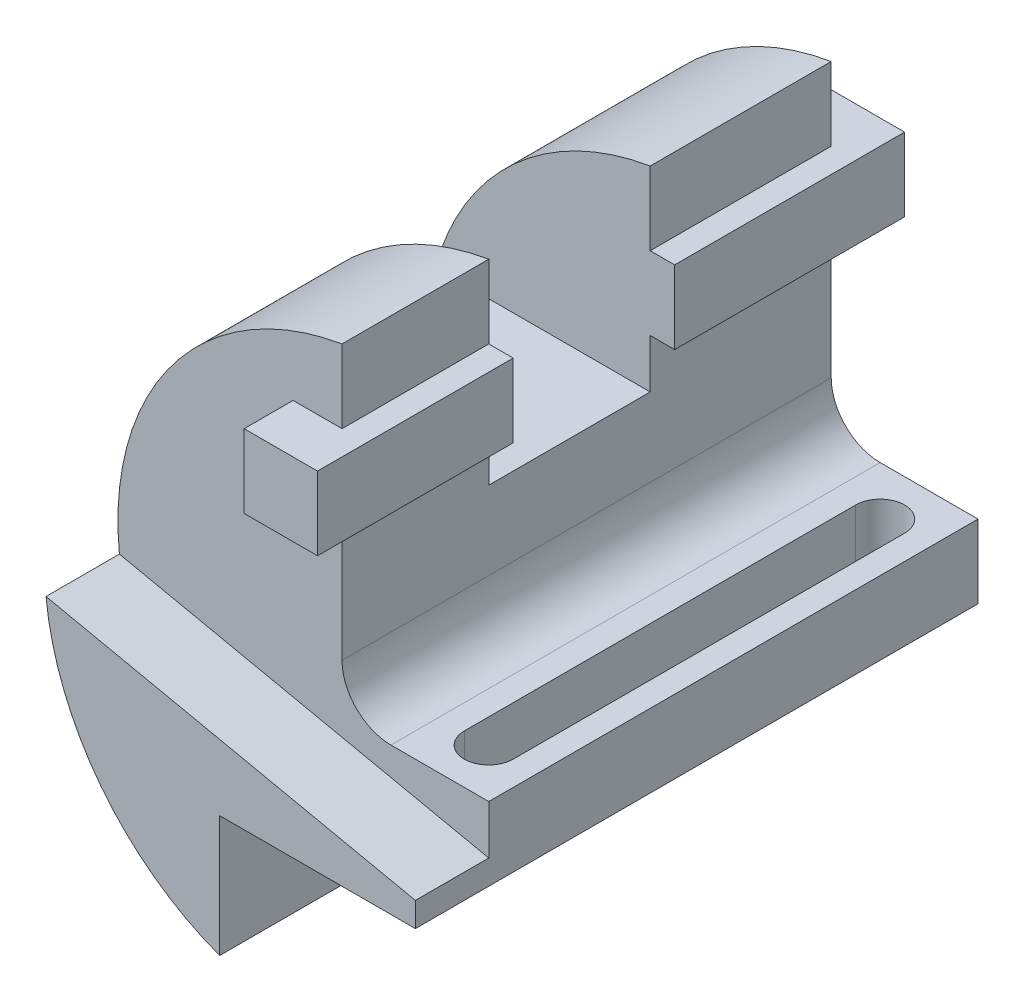
ISO-10303-21;
HEADER;
FILE_DESCRIPTION(('STEP AP214'),'2;1');
FILE_NAME('part.step','',(''),(''),'','','');
FILE_SCHEMA(('AUTOMOTIVE_DESIGN { 1 0 10303 214 1 1 1 1 }'));
ENDSEC;
DATA;
#1=APPLICATION_CONTEXT('core data for automotive mechanical design processes');
#2=APPLICATION_PROTOCOL_DEFINITION('international standard','automotive_design',2000,#1);
#3=PRODUCT_CONTEXT('',#1,'mechanical');
#4=PRODUCT('Part','Part','',(#3));
#5=PRODUCT_RELATED_PRODUCT_CATEGORY('part','',(#4));
#6=PRODUCT_DEFINITION_FORMATION('','',#4);
#7=PRODUCT_DEFINITION_CONTEXT('part definition',#1,'design');
#8=PRODUCT_DEFINITION('design','',#6,#7);
#9=PRODUCT_DEFINITION_SHAPE('','',#8);
#10=(LENGTH_UNIT() NAMED_UNIT(*) SI_UNIT(.MILLI.,.METRE.));
#11=(NAMED_UNIT(*) PLANE_ANGLE_UNIT() SI_UNIT($,.RADIAN.));
#12=(NAMED_UNIT(*) SI_UNIT($,.STERADIAN.) SOLID_ANGLE_UNIT());
#13=UNCERTAINTY_MEASURE_WITH_UNIT(LENGTH_MEASURE(1.E-05),#10,'distance_accuracy_value','');
#14=(GEOMETRIC_REPRESENTATION_CONTEXT(3) GLOBAL_UNCERTAINTY_ASSIGNED_CONTEXT((#13)) GLOBAL_UNIT_ASSIGNED_CONTEXT((#10,
#11,#12)) REPRESENTATION_CONTEXT('',''));
#15=CARTESIAN_POINT('',(0.,0.,0.));
#16=DIRECTION('',(0.,0.,1.));
#17=DIRECTION('',(1.,0.,0.));
#18=AXIS2_PLACEMENT_3D('',#15,#16,#17);
#19=CARTESIAN_POINT('',(-30.,25.,-100.));
#20=DIRECTION('',(1.,0.,0.));
#21=DIRECTION('',(0.,1.,0.));
#22=AXIS2_PLACEMENT_3D('',#19,#20,#21);
#23=PLANE('',#22);
#24=DIRECTION('',(0.,0.,1.));
#25=VECTOR('',#24,1.);
#26=CARTESIAN_POINT('',(-30.,66.,-100.));
#27=LINE('',#26,#25);
#28=CARTESIAN_POINT('',(-30.,66.,-30.));
#29=VERTEX_POINT('',#28);
#30=CARTESIAN_POINT('',(-30.,66.,0.));
#31=VERTEX_POINT('',#30);
#32=EDGE_CURVE('E273',#29,#31,#27,.T.);
#33=ORIENTED_EDGE('',*,*,#32,.F.);
#34=DIRECTION('',(0.,-1.,0.));
#35=VECTOR('',#34,1.);
#36=CARTESIAN_POINT('',(-30.,81.,-30.));
#37=LINE('',#36,#35);
#38=CARTESIAN_POINT('',(-30.,81.,-30.));
#39=VERTEX_POINT('',#38);
#40=EDGE_CURVE('E322',#39,#29,#37,.T.);
#41=ORIENTED_EDGE('',*,*,#40,.F.);
#42=DIRECTION('',(0.,0.,1.));
#43=VECTOR('',#42,1.);
#44=CARTESIAN_POINT('',(-30.,81.,-100.));
#45=LINE('',#44,#43);
#46=CARTESIAN_POINT('',(-30.,81.,0.));
#47=VERTEX_POINT('',#46);
#48=EDGE_CURVE('E438',#39,#47,#45,.T.);
#49=ORIENTED_EDGE('',*,*,#48,.T.);
#50=DIRECTION('',(0.,1.,0.));
#51=VECTOR('',#50,1.);
#52=CARTESIAN_POINT('',(-30.,25.,0.));
#53=LINE('',#52,#51);
#54=EDGE_CURVE('E428',#31,#47,#53,.T.);
#55=ORIENTED_EDGE('',*,*,#54,.F.);
#56=EDGE_LOOP('',(#33,#41,#49,#55));
#57=FACE_BOUND('',#56,.T.);
#58=ADVANCED_FACE('F43',(#57),#23,.T.);
#59=DIRECTION('',(0.,0.,1.));
#60=VECTOR('',#59,1.);
#61=CARTESIAN_POINT('',(-30.,66.,-100.));
#62=LINE('',#61,#60);
#63=CARTESIAN_POINT('',(-30.,66.,-100.));
#64=VERTEX_POINT('',#63);
#65=CARTESIAN_POINT('',(-30.,66.,-63.));
#66=VERTEX_POINT('',#65);
#67=EDGE_CURVE('E318',#64,#66,#62,.T.);
#68=ORIENTED_EDGE('',*,*,#67,.F.);
#69=DIRECTION('',(0.,1.,0.));
#70=VECTOR('',#69,1.);
#71=CARTESIAN_POINT('',(-30.,25.,-100.));
#72=LINE('',#71,#70);
#73=CARTESIAN_POINT('',(-30.,81.,-100.));
#74=VERTEX_POINT('',#73);
#75=EDGE_CURVE('E408',#64,#74,#72,.T.);
#76=ORIENTED_EDGE('',*,*,#75,.T.);
#77=CARTESIAN_POINT('',(-30.,81.,-63.));
#78=VERTEX_POINT('',#77);
#79=EDGE_CURVE('E435',#74,#78,#45,.T.);
#80=ORIENTED_EDGE('',*,*,#79,.T.);
#81=DIRECTION('',(0.,1.,0.));
#82=VECTOR('',#81,1.);
#83=CARTESIAN_POINT('',(-30.,41.,-63.));
#84=LINE('',#83,#82);
#85=EDGE_CURVE('E328',#66,#78,#84,.T.);
#86=ORIENTED_EDGE('',*,*,#85,.F.);
#87=EDGE_LOOP('',(#68,#76,#80,#86));
#88=FACE_BOUND('',#87,.T.);
#89=ADVANCED_FACE('F498',(#88),#23,.T.);
#90=CARTESIAN_POINT('',(-20.,25.,0.));
#91=DIRECTION('',(0.,0.,-1.));
#92=DIRECTION('',(-1.,0.,0.));
#93=AXIS2_PLACEMENT_3D('',#90,#91,#92);
#94=PLANE('',#93);
#95=DIRECTION('',(0.,-1.,0.));
#96=VECTOR('',#95,1.);
#97=CARTESIAN_POINT('',(-40.,25.,0.));
#98=LINE('',#97,#96);
#99=CARTESIAN_POINT('',(-40.,66.,0.));
#100=VERTEX_POINT('',#99);
#101=CARTESIAN_POINT('',(-40.,51.,0.));
#102=VERTEX_POINT('',#101);
#103=EDGE_CURVE('E64',#100,#102,#98,.T.);
#104=ORIENTED_EDGE('',*,*,#103,.F.);
#105=DIRECTION('',(1.,0.,0.));
#106=VECTOR('',#105,1.);
#107=CARTESIAN_POINT('',(-20.,66.,0.));
#108=LINE('',#107,#106);
#109=EDGE_CURVE('E276',#100,#31,#108,.T.);
#110=ORIENTED_EDGE('',*,*,#109,.T.);
#111=ORIENTED_EDGE('',*,*,#54,.T.);
#112=CARTESIAN_POINT('',(-20.799048266155,26.7750750374751,0.));
#113=DIRECTION('',(0.,0.,1.));
#114=DIRECTION('',(1.,0.,0.));
#115=AXIS2_PLACEMENT_3D('',#112,#113,#114);
#116=CIRCLE('',#115,55.);
#117=CARTESIAN_POINT('',(-75.5000628664946,21.0480337687723,0.));
#118=VERTEX_POINT('',#117);
#119=EDGE_CURVE('E402',#47,#118,#116,.T.);
#120=ORIENTED_EDGE('',*,*,#119,.T.);
#121=DIRECTION('',(-0.978147600733806,0.207911690817756,0.));
#122=VECTOR('',#121,1.);
#123=CARTESIAN_POINT('',(0.,5.,0.));
#124=LINE('',#123,#122);
#125=CARTESIAN_POINT('',(0.,5.,0.));
#126=VERTEX_POINT('',#125);
#127=EDGE_CURVE('E369',#126,#118,#124,.T.);
#128=ORIENTED_EDGE('',*,*,#127,.F.);
#129=DIRECTION('',(0.,1.,0.));
#130=VECTOR('',#129,1.);
#131=CARTESIAN_POINT('',(0.,0.,0.));
#132=LINE('',#131,#130);
#133=CARTESIAN_POINT('',(0.,15.,0.));
#134=VERTEX_POINT('',#133);
#135=EDGE_CURVE('E397',#126,#134,#132,.T.);
#136=ORIENTED_EDGE('',*,*,#135,.T.);
#137=DIRECTION('',(-1.,0.,0.));
#138=VECTOR('',#137,1.);
#139=CARTESIAN_POINT('',(0.,15.,0.));
#140=LINE('',#139,#138);
#141=CARTESIAN_POINT('',(-20.,15.,0.));
#142=VERTEX_POINT('',#141);
#143=EDGE_CURVE('E422',#134,#142,#140,.T.);
#144=ORIENTED_EDGE('',*,*,#143,.T.);
#145=CARTESIAN_POINT('',(-20.,25.,0.));
#146=DIRECTION('',(0.,0.,-1.));
#147=DIRECTION('',(-1.,0.,0.));
#148=AXIS2_PLACEMENT_3D('',#145,#146,#147);
#149=CIRCLE('',#148,10.);
#150=CARTESIAN_POINT('',(-30.,25.,0.));
#151=VERTEX_POINT('',#150);
#152=EDGE_CURVE('E425',#142,#151,#149,.T.);
#153=ORIENTED_EDGE('',*,*,#152,.T.);
#154=CARTESIAN_POINT('',(-30.,51.,0.));
#155=VERTEX_POINT('',#154);
#156=EDGE_CURVE('E429',#151,#155,#53,.T.);
#157=ORIENTED_EDGE('',*,*,#156,.T.);
#158=DIRECTION('',(-1.,0.,0.));
#159=VECTOR('',#158,1.);
#160=CARTESIAN_POINT('',(-20.,51.,0.));
#161=LINE('',#160,#159);
#162=EDGE_CURVE('E60',#155,#102,#161,.T.);
#163=ORIENTED_EDGE('',*,*,#162,.T.);
#164=EDGE_LOOP('',(#104,#110,#111,#120,#128,#136,#144,#153,#157,#163));
#165=FACE_BOUND('',#164,.T.);
#166=ADVANCED_FACE('F451',(#165),#94,.F.);
#167=CARTESIAN_POINT('',(0.,0.,-100.));
#168=DIRECTION('',(1.,0.,0.));
#169=DIRECTION('',(0.,0.,-1.));
#170=AXIS2_PLACEMENT_3D('',#167,#168,#169);
#171=PLANE('',#170);
#172=ORIENTED_EDGE('',*,*,#135,.F.);
#173=DIRECTION('',(0.,0.,-1.));
#174=VECTOR('',#173,1.);
#175=CARTESIAN_POINT('',(0.,5.,15.));
#176=LINE('',#175,#174);
#177=CARTESIAN_POINT('',(0.,5.,15.));
#178=VERTEX_POINT('',#177);
#179=EDGE_CURVE('E394',#178,#126,#176,.T.);
#180=ORIENTED_EDGE('',*,*,#179,.F.);
#181=DIRECTION('',(0.,1.,0.));
#182=VECTOR('',#181,1.);
#183=CARTESIAN_POINT('',(0.,0.,15.));
#184=LINE('',#183,#182);
#185=CARTESIAN_POINT('',(0.,0.,15.));
#186=VERTEX_POINT('',#185);
#187=EDGE_CURVE('E379',#186,#178,#184,.T.);
#188=ORIENTED_EDGE('',*,*,#187,.F.);
#189=DIRECTION('',(0.,0.,1.));
#190=VECTOR('',#189,1.);
#191=CARTESIAN_POINT('',(0.,0.,-100.));
#192=LINE('',#191,#190);
#193=CARTESIAN_POINT('',(0.,0.,-100.));
#194=VERTEX_POINT('',#193);
#195=EDGE_CURVE('E11',#194,#186,#192,.T.);
#196=ORIENTED_EDGE('',*,*,#195,.F.);
#197=DIRECTION('',(0.,1.,0.));
#198=VECTOR('',#197,1.);
#199=CARTESIAN_POINT('',(0.,0.,-100.));
#200=LINE('',#199,#198);
#201=CARTESIAN_POINT('',(0.,15.,-100.));
#202=VERTEX_POINT('',#201);
#203=EDGE_CURVE('E398',#194,#202,#200,.T.);
#204=ORIENTED_EDGE('',*,*,#203,.T.);
#205=DIRECTION('',(0.,0.,1.));
#206=VECTOR('',#205,1.);
#207=CARTESIAN_POINT('',(0.,15.,-100.));
#208=LINE('',#207,#206);
#209=EDGE_CURVE('E47',#202,#134,#208,.T.);
#210=ORIENTED_EDGE('',*,*,#209,.T.);
#211=EDGE_LOOP('',(#172,#180,#188,#196,#204,#210));
#212=FACE_BOUND('',#211,.T.);
#213=ADVANCED_FACE('F45',(#212),#171,.T.);
#214=CARTESIAN_POINT('',(0.,0.,-100.));
#215=DIRECTION('',(0.,-1.,0.));
#216=DIRECTION('',(1.,0.,0.));
#217=AXIS2_PLACEMENT_3D('',#214,#215,#216);
#218=PLANE('',#217);
#219=CARTESIAN_POINT('',(-9.99999999999997,0.,-90.));
#220=DIRECTION('',(0.,1.,0.));
#221=DIRECTION('',(-1.,0.,0.));
#222=AXIS2_PLACEMENT_3D('',#219,#220,#221);
#223=CIRCLE('',#222,5.);
#224=CARTESIAN_POINT('',(-4.99999999999997,0.,-90.));
#225=VERTEX_POINT('',#224);
#226=CARTESIAN_POINT('',(-15.,0.,-90.));
#227=VERTEX_POINT('',#226);
#228=EDGE_CURVE('E344',#225,#227,#223,.T.);
#229=ORIENTED_EDGE('',*,*,#228,.T.);
#230=DIRECTION('',(0.,0.,1.));
#231=VECTOR('',#230,1.);
#232=CARTESIAN_POINT('',(-15.,0.,-90.));
#233=LINE('',#232,#231);
#234=CARTESIAN_POINT('',(-15.,0.,-10.));
#235=VERTEX_POINT('',#234);
#236=EDGE_CURVE('E347',#227,#235,#233,.T.);
#237=ORIENTED_EDGE('',*,*,#236,.T.);
#238=CARTESIAN_POINT('',(-9.99999999999999,0.,-10.));
#239=DIRECTION('',(0.,1.,0.));
#240=DIRECTION('',(-1.,0.,0.));
#241=AXIS2_PLACEMENT_3D('',#238,#239,#240);
#242=CIRCLE('',#241,5.);
#243=CARTESIAN_POINT('',(-4.99999999999999,0.,-10.));
#244=VERTEX_POINT('',#243);
#245=EDGE_CURVE('E351',#235,#244,#242,.T.);
#246=ORIENTED_EDGE('',*,*,#245,.T.);
#247=DIRECTION('',(0.,0.,-1.));
#248=VECTOR('',#247,1.);
#249=CARTESIAN_POINT('',(-4.99999999999997,0.,-90.));
#250=LINE('',#249,#248);
#251=EDGE_CURVE('E354',#244,#225,#250,.T.);
#252=ORIENTED_EDGE('',*,*,#251,.T.);
#253=EDGE_LOOP('',(#229,#237,#246,#252));
#254=FACE_BOUND('',#253,.T.);
#255=ORIENTED_EDGE('',*,*,#195,.T.);
#256=DIRECTION('',(1.,0.,0.));
#257=VECTOR('',#256,1.);
#258=CARTESIAN_POINT('',(0.,0.,15.));
#259=LINE('',#258,#257);
#260=CARTESIAN_POINT('',(-40.,0.,15.));
#261=VERTEX_POINT('',#260);
#262=EDGE_CURVE('E376',#261,#186,#259,.T.);
#263=ORIENTED_EDGE('',*,*,#262,.F.);
#264=DIRECTION('',(0.,0.,1.));
#265=VECTOR('',#264,1.);
#266=CARTESIAN_POINT('',(-40.,0.,-100.));
#267=LINE('',#266,#265);
#268=CARTESIAN_POINT('',(-40.,0.,-100.));
#269=VERTEX_POINT('',#268);
#270=EDGE_CURVE('E52',#269,#261,#267,.T.);
#271=ORIENTED_EDGE('',*,*,#270,.F.);
#272=DIRECTION('',(1.,0.,0.));
#273=VECTOR('',#272,1.);
#274=CARTESIAN_POINT('',(0.,0.,-100.));
#275=LINE('',#274,#273);
#276=EDGE_CURVE('E418',#269,#194,#275,.T.);
#277=ORIENTED_EDGE('',*,*,#276,.T.);
#278=EDGE_LOOP('',(#255,#263,#271,#277));
#279=FACE_BOUND('',#278,.T.);
#280=ADVANCED_FACE('F471',(#254,#279),#218,.T.);
#281=CARTESIAN_POINT('',(-40.,0.,-100.));
#282=DIRECTION('',(1.,0.,0.));
#283=DIRECTION('',(0.,1.,0.));
#284=AXIS2_PLACEMENT_3D('',#281,#282,#283);
#285=PLANE('',#284);
#286=ORIENTED_EDGE('',*,*,#270,.T.);
#287=DIRECTION('',(0.,1.,0.));
#288=VECTOR('',#287,1.);
#289=CARTESIAN_POINT('',(-40.,0.,15.));
#290=LINE('',#289,#288);
#291=CARTESIAN_POINT('',(-40.,-24.7644578718805,15.));
#292=VERTEX_POINT('',#291);
#293=EDGE_CURVE('E386',#292,#261,#290,.T.);
#294=ORIENTED_EDGE('',*,*,#293,.F.);
#295=DIRECTION('',(0.,0.,1.));
#296=VECTOR('',#295,1.);
#297=CARTESIAN_POINT('',(-40.,-24.7644578718805,-100.));
#298=LINE('',#297,#296);
#299=CARTESIAN_POINT('',(-40.,-24.7644578718805,-100.));
#300=VERTEX_POINT('',#299);
#301=EDGE_CURVE('E433',#300,#292,#298,.T.);
#302=ORIENTED_EDGE('',*,*,#301,.F.);
#303=DIRECTION('',(0.,1.,0.));
#304=VECTOR('',#303,1.);
#305=CARTESIAN_POINT('',(-40.,0.,-100.));
#306=LINE('',#305,#304);
#307=EDGE_CURVE('E415',#300,#269,#306,.T.);
#308=ORIENTED_EDGE('',*,*,#307,.T.);
#309=EDGE_LOOP('',(#286,#294,#302,#308));
#310=FACE_BOUND('',#309,.T.);
#311=ADVANCED_FACE('F467',(#310),#285,.T.);
#312=CARTESIAN_POINT('',(-20.799048266155,26.7750750374751,-100.));
#313=DIRECTION('',(0.,0.,1.));
#314=DIRECTION('',(1.,0.,0.));
#315=AXIS2_PLACEMENT_3D('',#312,#313,#314);
#316=CYLINDRICAL_SURFACE('',#315,55.);
#317=CARTESIAN_POINT('',(-20.799048266155,26.7750750374751,-63.));
#318=DIRECTION('',(0.,0.,-1.));
#319=DIRECTION('',(-1.,0.,0.));
#320=AXIS2_PLACEMENT_3D('',#317,#318,#319);
#321=CIRCLE('',#320,55.);
#322=CARTESIAN_POINT('',(-73.927679999059,41.,-63.));
#323=VERTEX_POINT('',#322);
#324=EDGE_CURVE('E341',#78,#323,#321,.F.);
#325=ORIENTED_EDGE('',*,*,#324,.F.);
#326=ORIENTED_EDGE('',*,*,#79,.F.);
#327=CARTESIAN_POINT('',(-20.799048266155,26.7750750374751,-100.));
#328=DIRECTION('',(0.,0.,1.));
#329=DIRECTION('',(1.,0.,0.));
#330=AXIS2_PLACEMENT_3D('',#327,#328,#329);
#331=CIRCLE('',#330,55.);
#332=EDGE_CURVE('E412',#74,#300,#331,.T.);
#333=ORIENTED_EDGE('',*,*,#332,.T.);
#334=ORIENTED_EDGE('',*,*,#301,.T.);
#335=CARTESIAN_POINT('',(-20.7990482661547,26.7750750374753,15.));
#336=DIRECTION('',(0.,0.,1.));
#337=DIRECTION('',(1.,0.,0.));
#338=AXIS2_PLACEMENT_3D('',#335,#336,#337);
#339=CIRCLE('',#338,55.0000000000003);
#340=CARTESIAN_POINT('',(-75.5000628664946,21.0480337687723,15.));
#341=VERTEX_POINT('',#340);
#342=EDGE_CURVE('E383',#341,#292,#339,.T.);
#343=ORIENTED_EDGE('',*,*,#342,.F.);
#344=DIRECTION('',(0.,0.,-1.));
#345=VECTOR('',#344,1.);
#346=CARTESIAN_POINT('',(-75.5000628664946,21.0480337687723,15.));
#347=LINE('',#346,#345);
#348=EDGE_CURVE('E389',#341,#118,#347,.T.);
#349=ORIENTED_EDGE('',*,*,#348,.T.);
#350=ORIENTED_EDGE('',*,*,#119,.F.);
#351=ORIENTED_EDGE('',*,*,#48,.F.);
#352=CARTESIAN_POINT('',(-20.799048266155,26.7750750374751,-30.));
#353=DIRECTION('',(0.,0.,1.));
#354=DIRECTION('',(0.,-1.,0.));
#355=AXIS2_PLACEMENT_3D('',#352,#353,#354);
#356=CIRCLE('',#355,55.);
#357=CARTESIAN_POINT('',(-73.927679999059,41.,-30.));
#358=VERTEX_POINT('',#357);
#359=EDGE_CURVE('E335',#358,#39,#356,.F.);
#360=ORIENTED_EDGE('',*,*,#359,.F.);
#361=DIRECTION('',(0.,0.,1.));
#362=VECTOR('',#361,1.);
#363=CARTESIAN_POINT('',(-73.927679999059,41.,-100.));
#364=LINE('',#363,#362);
#365=EDGE_CURVE('E339',#323,#358,#364,.T.);
#366=ORIENTED_EDGE('',*,*,#365,.F.);
#367=EDGE_LOOP('',(#325,#326,#333,#334,#343,#349,#350,#351,#360,#366));
#368=FACE_BOUND('',#367,.T.);
#369=ADVANCED_FACE('F460',(#368),#316,.T.);
#370=DIRECTION('',(0.,0.,-1.));
#371=VECTOR('',#370,1.);
#372=CARTESIAN_POINT('',(-30.,51.,-100.));
#373=LINE('',#372,#371);
#374=CARTESIAN_POINT('',(-30.,51.,-30.));
#375=VERTEX_POINT('',#374);
#376=EDGE_CURVE('E269',#155,#375,#373,.T.);
#377=ORIENTED_EDGE('',*,*,#376,.F.);
#378=ORIENTED_EDGE('',*,*,#156,.F.);
#379=DIRECTION('',(0.,0.,1.));
#380=VECTOR('',#379,1.);
#381=CARTESIAN_POINT('',(-30.,25.,-100.));
#382=LINE('',#381,#380);
#383=CARTESIAN_POINT('',(-30.,25.,-100.));
#384=VERTEX_POINT('',#383);
#385=EDGE_CURVE('E439',#384,#151,#382,.T.);
#386=ORIENTED_EDGE('',*,*,#385,.F.);
#387=CARTESIAN_POINT('',(-30.,51.,-100.));
#388=VERTEX_POINT('',#387);
#389=EDGE_CURVE('E409',#384,#388,#72,.T.);
#390=ORIENTED_EDGE('',*,*,#389,.T.);
#391=DIRECTION('',(0.,0.,-1.));
#392=VECTOR('',#391,1.);
#393=CARTESIAN_POINT('',(-30.,51.,-100.));
#394=LINE('',#393,#392);
#395=CARTESIAN_POINT('',(-30.,51.,-63.));
#396=VERTEX_POINT('',#395);
#397=EDGE_CURVE('E312',#396,#388,#394,.T.);
#398=ORIENTED_EDGE('',*,*,#397,.F.);
#399=CARTESIAN_POINT('',(-30.,41.,-63.));
#400=VERTEX_POINT('',#399);
#401=EDGE_CURVE('E329',#400,#396,#84,.T.);
#402=ORIENTED_EDGE('',*,*,#401,.F.);
#403=DIRECTION('',(0.,0.,-1.));
#404=VECTOR('',#403,1.);
#405=CARTESIAN_POINT('',(-30.,41.,-30.));
#406=LINE('',#405,#404);
#407=CARTESIAN_POINT('',(-30.,41.,-30.));
#408=VERTEX_POINT('',#407);
#409=EDGE_CURVE('E325',#408,#400,#406,.T.);
#410=ORIENTED_EDGE('',*,*,#409,.F.);
#411=EDGE_CURVE('E321',#375,#408,#37,.T.);
#412=ORIENTED_EDGE('',*,*,#411,.F.);
#413=EDGE_LOOP('',(#377,#378,#386,#390,#398,#402,#410,#412));
#414=FACE_BOUND('',#413,.T.);
#415=ADVANCED_FACE('F481',(#414),#23,.T.);
#416=CARTESIAN_POINT('',(-20.,25.,-100.));
#417=DIRECTION('',(0.,0.,1.));
#418=DIRECTION('',(1.,0.,0.));
#419=AXIS2_PLACEMENT_3D('',#416,#417,#418);
#420=CYLINDRICAL_SURFACE('',#419,10.);
#421=ORIENTED_EDGE('',*,*,#152,.F.);
#422=DIRECTION('',(0.,0.,1.));
#423=VECTOR('',#422,1.);
#424=CARTESIAN_POINT('',(-20.,15.,-100.));
#425=LINE('',#424,#423);
#426=CARTESIAN_POINT('',(-20.,15.,-100.));
#427=VERTEX_POINT('',#426);
#428=EDGE_CURVE('E440',#427,#142,#425,.T.);
#429=ORIENTED_EDGE('',*,*,#428,.F.);
#430=CARTESIAN_POINT('',(-20.,25.,-100.));
#431=DIRECTION('',(0.,0.,-1.));
#432=DIRECTION('',(-1.,0.,0.));
#433=AXIS2_PLACEMENT_3D('',#430,#431,#432);
#434=CIRCLE('',#433,10.);
#435=EDGE_CURVE('E405',#427,#384,#434,.T.);
#436=ORIENTED_EDGE('',*,*,#435,.T.);
#437=ORIENTED_EDGE('',*,*,#385,.T.);
#438=EDGE_LOOP('',(#421,#429,#436,#437));
#439=FACE_BOUND('',#438,.T.);
#440=ADVANCED_FACE('F478',(#439),#420,.F.);
#441=CARTESIAN_POINT('',(0.,15.,-100.));
#442=DIRECTION('',(0.,1.,0.));
#443=DIRECTION('',(-1.,0.,0.));
#444=AXIS2_PLACEMENT_3D('',#441,#442,#443);
#445=PLANE('',#444);
#446=CARTESIAN_POINT('',(-9.99999999999997,15.,-90.));
#447=DIRECTION('',(0.,1.,0.));
#448=DIRECTION('',(-1.,0.,0.));
#449=AXIS2_PLACEMENT_3D('',#446,#447,#448);
#450=CIRCLE('',#449,5.);
#451=CARTESIAN_POINT('',(-4.99999999999997,15.,-90.));
#452=VERTEX_POINT('',#451);
#453=CARTESIAN_POINT('',(-15.,15.,-90.));
#454=VERTEX_POINT('',#453);
#455=EDGE_CURVE('E343',#452,#454,#450,.T.);
#456=ORIENTED_EDGE('',*,*,#455,.F.);
#457=DIRECTION('',(0.,0.,-1.));
#458=VECTOR('',#457,1.);
#459=CARTESIAN_POINT('',(-4.99999999999997,15.,-90.));
#460=LINE('',#459,#458);
#461=CARTESIAN_POINT('',(-4.99999999999999,15.,-10.));
#462=VERTEX_POINT('',#461);
#463=EDGE_CURVE('E348',#462,#452,#460,.T.);
#464=ORIENTED_EDGE('',*,*,#463,.F.);
#465=CARTESIAN_POINT('',(-9.99999999999999,15.,-10.));
#466=DIRECTION('',(0.,1.,0.));
#467=DIRECTION('',(-1.,0.,0.));
#468=AXIS2_PLACEMENT_3D('',#465,#466,#467);
#469=CIRCLE('',#468,5.);
#470=CARTESIAN_POINT('',(-15.,15.,-10.));
#471=VERTEX_POINT('',#470);
#472=EDGE_CURVE('E362',#471,#462,#469,.T.);
#473=ORIENTED_EDGE('',*,*,#472,.F.);
#474=DIRECTION('',(0.,0.,1.));
#475=VECTOR('',#474,1.);
#476=CARTESIAN_POINT('',(-15.,15.,-90.));
#477=LINE('',#476,#475);
#478=EDGE_CURVE('E359',#454,#471,#477,.T.);
#479=ORIENTED_EDGE('',*,*,#478,.F.);
#480=EDGE_LOOP('',(#456,#464,#473,#479));
#481=FACE_BOUND('',#480,.T.);
#482=ORIENTED_EDGE('',*,*,#143,.F.);
#483=ORIENTED_EDGE('',*,*,#209,.F.);
#484=DIRECTION('',(-1.,0.,0.));
#485=VECTOR('',#484,1.);
#486=CARTESIAN_POINT('',(0.,15.,-100.));
#487=LINE('',#486,#485);
#488=EDGE_CURVE('E401',#202,#427,#487,.T.);
#489=ORIENTED_EDGE('',*,*,#488,.T.);
#490=ORIENTED_EDGE('',*,*,#428,.T.);
#491=EDGE_LOOP('',(#482,#483,#489,#490));
#492=FACE_BOUND('',#491,.T.);
#493=ADVANCED_FACE('F450',(#481,#492),#445,.T.);
#494=CARTESIAN_POINT('',(-20.,25.,-100.));
#495=DIRECTION('',(0.,0.,-1.));
#496=DIRECTION('',(-1.,0.,0.));
#497=AXIS2_PLACEMENT_3D('',#494,#495,#496);
#498=PLANE('',#497);
#499=DIRECTION('',(1.,0.,0.));
#500=VECTOR('',#499,1.);
#501=CARTESIAN_POINT('',(-20.,66.,-100.));
#502=LINE('',#501,#500);
#503=CARTESIAN_POINT('',(-40.,66.,-100.));
#504=VERTEX_POINT('',#503);
#505=EDGE_CURVE('E315',#504,#64,#502,.T.);
#506=ORIENTED_EDGE('',*,*,#505,.F.);
#507=DIRECTION('',(0.,1.,0.));
#508=VECTOR('',#507,1.);
#509=CARTESIAN_POINT('',(-40.,25.,-100.));
#510=LINE('',#509,#508);
#511=CARTESIAN_POINT('',(-40.,51.,-100.));
#512=VERTEX_POINT('',#511);
#513=EDGE_CURVE('E301',#512,#504,#510,.T.);
#514=ORIENTED_EDGE('',*,*,#513,.F.);
#515=DIRECTION('',(-1.,0.,0.));
#516=VECTOR('',#515,1.);
#517=CARTESIAN_POINT('',(-20.,51.,-100.));
#518=LINE('',#517,#516);
#519=EDGE_CURVE('E309',#388,#512,#518,.T.);
#520=ORIENTED_EDGE('',*,*,#519,.F.);
#521=ORIENTED_EDGE('',*,*,#389,.F.);
#522=ORIENTED_EDGE('',*,*,#435,.F.);
#523=ORIENTED_EDGE('',*,*,#488,.F.);
#524=ORIENTED_EDGE('',*,*,#203,.F.);
#525=ORIENTED_EDGE('',*,*,#276,.F.);
#526=ORIENTED_EDGE('',*,*,#307,.F.);
#527=ORIENTED_EDGE('',*,*,#332,.F.);
#528=ORIENTED_EDGE('',*,*,#75,.F.);
#529=EDGE_LOOP('',(#506,#514,#520,#521,#522,#523,#524,#525,#526,#527,#528));
#530=FACE_BOUND('',#529,.T.);
#531=ADVANCED_FACE('F474',(#530),#498,.T.);
#532=CARTESIAN_POINT('',(0.,5.,15.));
#533=DIRECTION('',(-0.207911690817756,-0.978147600733806,0.));
#534=DIRECTION('',(0.978147600733806,-0.207911690817756,0.));
#535=AXIS2_PLACEMENT_3D('',#532,#533,#534);
#536=PLANE('',#535);
#537=ORIENTED_EDGE('',*,*,#127,.T.);
#538=ORIENTED_EDGE('',*,*,#348,.F.);
#539=DIRECTION('',(-0.978147600733806,0.207911690817756,0.));
#540=VECTOR('',#539,1.);
#541=CARTESIAN_POINT('',(0.,5.,15.));
#542=LINE('',#541,#540);
#543=EDGE_CURVE('E381',#178,#341,#542,.T.);
#544=ORIENTED_EDGE('',*,*,#543,.F.);
#545=ORIENTED_EDGE('',*,*,#179,.T.);
#546=EDGE_LOOP('',(#537,#538,#544,#545));
#547=FACE_BOUND('',#546,.T.);
#548=ADVANCED_FACE('F455',(#547),#536,.F.);
#549=CARTESIAN_POINT('',(-20.7990482661547,26.7750750374753,15.));
#550=DIRECTION('',(0.,0.,1.));
#551=DIRECTION('',(1.,0.,0.));
#552=AXIS2_PLACEMENT_3D('',#549,#550,#551);
#553=PLANE('',#552);
#554=ORIENTED_EDGE('',*,*,#262,.T.);
#555=ORIENTED_EDGE('',*,*,#187,.T.);
#556=ORIENTED_EDGE('',*,*,#543,.T.);
#557=ORIENTED_EDGE('',*,*,#342,.T.);
#558=ORIENTED_EDGE('',*,*,#293,.T.);
#559=EDGE_LOOP('',(#554,#555,#556,#557,#558));
#560=FACE_BOUND('',#559,.T.);
#561=ADVANCED_FACE('F464',(#560),#553,.T.);
#562=CARTESIAN_POINT('',(-9.99999999999997,0.,-90.));
#563=DIRECTION('',(0.,1.,0.));
#564=DIRECTION('',(-1.,0.,0.));
#565=AXIS2_PLACEMENT_3D('',#562,#563,#564);
#566=CYLINDRICAL_SURFACE('',#565,5.);
#567=ORIENTED_EDGE('',*,*,#455,.T.);
#568=DIRECTION('',(0.,1.,0.));
#569=VECTOR('',#568,1.);
#570=CARTESIAN_POINT('',(-15.,0.,-90.));
#571=LINE('',#570,#569);
#572=EDGE_CURVE('E357',#227,#454,#571,.T.);
#573=ORIENTED_EDGE('',*,*,#572,.F.);
#574=ORIENTED_EDGE('',*,*,#228,.F.);
#575=DIRECTION('',(0.,1.,0.));
#576=VECTOR('',#575,1.);
#577=CARTESIAN_POINT('',(-4.99999999999997,0.,-90.));
#578=LINE('',#577,#576);
#579=EDGE_CURVE('E367',#225,#452,#578,.T.);
#580=ORIENTED_EDGE('',*,*,#579,.T.);
#581=EDGE_LOOP('',(#567,#573,#574,#580));
#582=FACE_BOUND('',#581,.T.);
#583=ADVANCED_FACE('F532',(#582),#566,.F.);
#584=CARTESIAN_POINT('',(-4.99999999999997,0.,-90.));
#585=DIRECTION('',(1.,0.,0.));
#586=DIRECTION('',(0.,0.,-1.));
#587=AXIS2_PLACEMENT_3D('',#584,#585,#586);
#588=PLANE('',#587);
#589=ORIENTED_EDGE('',*,*,#463,.T.);
#590=ORIENTED_EDGE('',*,*,#579,.F.);
#591=ORIENTED_EDGE('',*,*,#251,.F.);
#592=DIRECTION('',(0.,1.,0.));
#593=VECTOR('',#592,1.);
#594=CARTESIAN_POINT('',(-4.99999999999999,0.,-10.));
#595=LINE('',#594,#593);
#596=EDGE_CURVE('E370',#244,#462,#595,.T.);
#597=ORIENTED_EDGE('',*,*,#596,.T.);
#598=EDGE_LOOP('',(#589,#590,#591,#597));
#599=FACE_BOUND('',#598,.T.);
#600=ADVANCED_FACE('F535',(#599),#588,.F.);
#601=CARTESIAN_POINT('',(-9.99999999999999,0.,-10.));
#602=DIRECTION('',(0.,1.,0.));
#603=DIRECTION('',(-1.,0.,0.));
#604=AXIS2_PLACEMENT_3D('',#601,#602,#603);
#605=CYLINDRICAL_SURFACE('',#604,5.);
#606=ORIENTED_EDGE('',*,*,#472,.T.);
#607=ORIENTED_EDGE('',*,*,#596,.F.);
#608=ORIENTED_EDGE('',*,*,#245,.F.);
#609=DIRECTION('',(0.,1.,0.));
#610=VECTOR('',#609,1.);
#611=CARTESIAN_POINT('',(-15.,0.,-10.));
#612=LINE('',#611,#610);
#613=EDGE_CURVE('E372',#235,#471,#612,.T.);
#614=ORIENTED_EDGE('',*,*,#613,.T.);
#615=EDGE_LOOP('',(#606,#607,#608,#614));
#616=FACE_BOUND('',#615,.T.);
#617=ADVANCED_FACE('F540',(#616),#605,.F.);
#618=CARTESIAN_POINT('',(-15.,0.,-90.));
#619=DIRECTION('',(-1.,0.,0.));
#620=DIRECTION('',(0.,0.,1.));
#621=AXIS2_PLACEMENT_3D('',#618,#619,#620);
#622=PLANE('',#621);
#623=ORIENTED_EDGE('',*,*,#478,.T.);
#624=ORIENTED_EDGE('',*,*,#613,.F.);
#625=ORIENTED_EDGE('',*,*,#236,.F.);
#626=ORIENTED_EDGE('',*,*,#572,.T.);
#627=EDGE_LOOP('',(#623,#624,#625,#626));
#628=FACE_BOUND('',#627,.T.);
#629=ADVANCED_FACE('F537',(#628),#622,.F.);
#630=CARTESIAN_POINT('',(-75.799048266155,41.,-63.));
#631=DIRECTION('',(0.,0.,-1.));
#632=DIRECTION('',(-1.,0.,0.));
#633=AXIS2_PLACEMENT_3D('',#630,#631,#632);
#634=PLANE('',#633);
#635=ORIENTED_EDGE('',*,*,#401,.T.);
#636=DIRECTION('',(1.,0.,0.));
#637=VECTOR('',#636,1.);
#638=CARTESIAN_POINT('',(-40.,51.,-63.));
#639=LINE('',#638,#637);
#640=CARTESIAN_POINT('',(-25.,51.,-63.));
#641=VERTEX_POINT('',#640);
#642=EDGE_CURVE('E298',#396,#641,#639,.T.);
#643=ORIENTED_EDGE('',*,*,#642,.T.);
#644=DIRECTION('',(0.,-1.,0.));
#645=VECTOR('',#644,1.);
#646=CARTESIAN_POINT('',(-25.,51.,-63.));
#647=LINE('',#646,#645);
#648=CARTESIAN_POINT('',(-25.,66.,-63.));
#649=VERTEX_POINT('',#648);
#650=EDGE_CURVE('E278',#649,#641,#647,.T.);
#651=ORIENTED_EDGE('',*,*,#650,.F.);
#652=DIRECTION('',(1.,0.,0.));
#653=VECTOR('',#652,1.);
#654=CARTESIAN_POINT('',(-40.,66.,-63.));
#655=LINE('',#654,#653);
#656=EDGE_CURVE('E299',#66,#649,#655,.T.);
#657=ORIENTED_EDGE('',*,*,#656,.F.);
#658=ORIENTED_EDGE('',*,*,#85,.T.);
#659=ORIENTED_EDGE('',*,*,#324,.T.);
#660=DIRECTION('',(1.,0.,0.));
#661=VECTOR('',#660,1.);
#662=CARTESIAN_POINT('',(-75.799048266155,41.,-63.));
#663=LINE('',#662,#661);
#664=EDGE_CURVE('E333',#323,#400,#663,.T.);
#665=ORIENTED_EDGE('',*,*,#664,.T.);
#666=EDGE_LOOP('',(#635,#643,#651,#657,#658,#659,#665));
#667=FACE_BOUND('',#666,.T.);
#668=ADVANCED_FACE('F539',(#667),#634,.F.);
#669=CARTESIAN_POINT('',(-75.799048266155,41.,-30.));
#670=DIRECTION('',(0.,-1.,0.));
#671=DIRECTION('',(1.,0.,0.));
#672=AXIS2_PLACEMENT_3D('',#669,#670,#671);
#673=PLANE('',#672);
#674=ORIENTED_EDGE('',*,*,#365,.T.);
#675=DIRECTION('',(1.,0.,0.));
#676=VECTOR('',#675,1.);
#677=CARTESIAN_POINT('',(-75.799048266155,41.,-30.));
#678=LINE('',#677,#676);
#679=EDGE_CURVE('E332',#358,#408,#678,.T.);
#680=ORIENTED_EDGE('',*,*,#679,.T.);
#681=ORIENTED_EDGE('',*,*,#409,.T.);
#682=ORIENTED_EDGE('',*,*,#664,.F.);
#683=EDGE_LOOP('',(#674,#680,#681,#682));
#684=FACE_BOUND('',#683,.T.);
#685=ADVANCED_FACE('F551',(#684),#673,.F.);
#686=CARTESIAN_POINT('',(-75.799048266155,81.,-30.));
#687=DIRECTION('',(0.,0.,1.));
#688=DIRECTION('',(0.,-1.,0.));
#689=AXIS2_PLACEMENT_3D('',#686,#687,#688);
#690=PLANE('',#689);
#691=ORIENTED_EDGE('',*,*,#40,.T.);
#692=DIRECTION('',(1.,0.,0.));
#693=VECTOR('',#692,1.);
#694=CARTESIAN_POINT('',(-40.,66.,-30.));
#695=LINE('',#694,#693);
#696=CARTESIAN_POINT('',(-25.,66.,-30.));
#697=VERTEX_POINT('',#696);
#698=EDGE_CURVE('E263',#29,#697,#695,.T.);
#699=ORIENTED_EDGE('',*,*,#698,.T.);
#700=DIRECTION('',(0.,1.,0.));
#701=VECTOR('',#700,1.);
#702=CARTESIAN_POINT('',(-25.,51.,-30.));
#703=LINE('',#702,#701);
#704=CARTESIAN_POINT('',(-25.,51.,-30.));
#705=VERTEX_POINT('',#704);
#706=EDGE_CURVE('E253',#705,#697,#703,.T.);
#707=ORIENTED_EDGE('',*,*,#706,.F.);
#708=DIRECTION('',(1.,0.,0.));
#709=VECTOR('',#708,1.);
#710=CARTESIAN_POINT('',(-40.,51.,-30.));
#711=LINE('',#710,#709);
#712=EDGE_CURVE('E265',#375,#705,#711,.T.);
#713=ORIENTED_EDGE('',*,*,#712,.F.);
#714=ORIENTED_EDGE('',*,*,#411,.T.);
#715=ORIENTED_EDGE('',*,*,#679,.F.);
#716=ORIENTED_EDGE('',*,*,#359,.T.);
#717=EDGE_LOOP('',(#691,#699,#707,#713,#714,#715,#716));
#718=FACE_BOUND('',#717,.T.);
#719=ADVANCED_FACE('F548',(#718),#690,.F.);
#720=CARTESIAN_POINT('',(-40.,66.,-63.));
#721=DIRECTION('',(0.,1.,0.));
#722=DIRECTION('',(-1.,0.,0.));
#723=AXIS2_PLACEMENT_3D('',#720,#721,#722);
#724=PLANE('',#723);
#725=ORIENTED_EDGE('',*,*,#505,.T.);
#726=ORIENTED_EDGE('',*,*,#67,.T.);
#727=ORIENTED_EDGE('',*,*,#656,.T.);
#728=DIRECTION('',(0.,0.,1.));
#729=VECTOR('',#728,1.);
#730=CARTESIAN_POINT('',(-25.,66.,-63.));
#731=LINE('',#730,#729);
#732=CARTESIAN_POINT('',(-25.,66.,-110.));
#733=VERTEX_POINT('',#732);
#734=EDGE_CURVE('E287',#733,#649,#731,.T.);
#735=ORIENTED_EDGE('',*,*,#734,.F.);
#736=DIRECTION('',(1.,0.,0.));
#737=VECTOR('',#736,1.);
#738=CARTESIAN_POINT('',(-40.,66.,-110.));
#739=LINE('',#738,#737);
#740=CARTESIAN_POINT('',(-40.,66.,-110.));
#741=VERTEX_POINT('',#740);
#742=EDGE_CURVE('E302',#741,#733,#739,.T.);
#743=ORIENTED_EDGE('',*,*,#742,.F.);
#744=DIRECTION('',(0.,0.,1.));
#745=VECTOR('',#744,1.);
#746=CARTESIAN_POINT('',(-40.,66.,-63.));
#747=LINE('',#746,#745);
#748=EDGE_CURVE('E295',#741,#504,#747,.T.);
#749=ORIENTED_EDGE('',*,*,#748,.T.);
#750=EDGE_LOOP('',(#725,#726,#727,#735,#743,#749));
#751=FACE_BOUND('',#750,.T.);
#752=ADVANCED_FACE('F550',(#751),#724,.T.);
#753=CARTESIAN_POINT('',(-40.,66.,-110.));
#754=DIRECTION('',(0.,0.,-1.));
#755=DIRECTION('',(-1.,0.,0.));
#756=AXIS2_PLACEMENT_3D('',#753,#754,#755);
#757=PLANE('',#756);
#758=ORIENTED_EDGE('',*,*,#742,.T.);
#759=DIRECTION('',(0.,1.,0.));
#760=VECTOR('',#759,1.);
#761=CARTESIAN_POINT('',(-25.,66.,-110.));
#762=LINE('',#761,#760);
#763=CARTESIAN_POINT('',(-25.,51.,-110.));
#764=VERTEX_POINT('',#763);
#765=EDGE_CURVE('E284',#764,#733,#762,.T.);
#766=ORIENTED_EDGE('',*,*,#765,.F.);
#767=DIRECTION('',(1.,0.,0.));
#768=VECTOR('',#767,1.);
#769=CARTESIAN_POINT('',(-40.,51.,-110.));
#770=LINE('',#769,#768);
#771=CARTESIAN_POINT('',(-40.,51.,-110.));
#772=VERTEX_POINT('',#771);
#773=EDGE_CURVE('E304',#772,#764,#770,.T.);
#774=ORIENTED_EDGE('',*,*,#773,.F.);
#775=DIRECTION('',(0.,1.,0.));
#776=VECTOR('',#775,1.);
#777=CARTESIAN_POINT('',(-40.,66.,-110.));
#778=LINE('',#777,#776);
#779=EDGE_CURVE('E292',#772,#741,#778,.T.);
#780=ORIENTED_EDGE('',*,*,#779,.T.);
#781=EDGE_LOOP('',(#758,#766,#774,#780));
#782=FACE_BOUND('',#781,.T.);
#783=ADVANCED_FACE('F562',(#782),#757,.T.);
#784=CARTESIAN_POINT('',(-40.,51.,-110.));
#785=DIRECTION('',(0.,-1.,0.));
#786=DIRECTION('',(0.,0.,-1.));
#787=AXIS2_PLACEMENT_3D('',#784,#785,#786);
#788=PLANE('',#787);
#789=ORIENTED_EDGE('',*,*,#642,.F.);
#790=ORIENTED_EDGE('',*,*,#397,.T.);
#791=ORIENTED_EDGE('',*,*,#519,.T.);
#792=DIRECTION('',(0.,0.,-1.));
#793=VECTOR('',#792,1.);
#794=CARTESIAN_POINT('',(-40.,51.,-110.));
#795=LINE('',#794,#793);
#796=EDGE_CURVE('E290',#512,#772,#795,.T.);
#797=ORIENTED_EDGE('',*,*,#796,.T.);
#798=ORIENTED_EDGE('',*,*,#773,.T.);
#799=DIRECTION('',(0.,0.,-1.));
#800=VECTOR('',#799,1.);
#801=CARTESIAN_POINT('',(-25.,51.,-110.));
#802=LINE('',#801,#800);
#803=EDGE_CURVE('E281',#641,#764,#802,.T.);
#804=ORIENTED_EDGE('',*,*,#803,.F.);
#805=EDGE_LOOP('',(#789,#790,#791,#797,#798,#804));
#806=FACE_BOUND('',#805,.T.);
#807=ADVANCED_FACE('F558',(#806),#788,.T.);
#808=CARTESIAN_POINT('',(-40.,0.,0.));
#809=DIRECTION('',(-1.,0.,0.));
#810=DIRECTION('',(0.,0.,1.));
#811=AXIS2_PLACEMENT_3D('',#808,#809,#810);
#812=PLANE('',#811);
#813=ORIENTED_EDGE('',*,*,#796,.F.);
#814=ORIENTED_EDGE('',*,*,#513,.T.);
#815=ORIENTED_EDGE('',*,*,#748,.F.);
#816=ORIENTED_EDGE('',*,*,#779,.F.);
#817=EDGE_LOOP('',(#813,#814,#815,#816));
#818=FACE_BOUND('',#817,.T.);
#819=ADVANCED_FACE('F561',(#818),#812,.T.);
#820=CARTESIAN_POINT('',(-25.,0.,0.));
#821=DIRECTION('',(-1.,0.,0.));
#822=DIRECTION('',(0.,0.,1.));
#823=AXIS2_PLACEMENT_3D('',#820,#821,#822);
#824=PLANE('',#823);
#825=ORIENTED_EDGE('',*,*,#650,.T.);
#826=ORIENTED_EDGE('',*,*,#803,.T.);
#827=ORIENTED_EDGE('',*,*,#765,.T.);
#828=ORIENTED_EDGE('',*,*,#734,.T.);
#829=EDGE_LOOP('',(#825,#826,#827,#828));
#830=FACE_BOUND('',#829,.T.);
#831=ADVANCED_FACE('F572',(#830),#824,.F.);
#832=CARTESIAN_POINT('',(-40.,66.,-30.));
#833=DIRECTION('',(0.,1.,0.));
#834=DIRECTION('',(-1.,0.,0.));
#835=AXIS2_PLACEMENT_3D('',#832,#833,#834);
#836=PLANE('',#835);
#837=ORIENTED_EDGE('',*,*,#109,.F.);
#838=DIRECTION('',(0.,0.,1.));
#839=VECTOR('',#838,1.);
#840=CARTESIAN_POINT('',(-40.,66.,-30.));
#841=LINE('',#840,#839);
#842=CARTESIAN_POINT('',(-40.,66.,10.));
#843=VERTEX_POINT('',#842);
#844=EDGE_CURVE('E235',#100,#843,#841,.T.);
#845=ORIENTED_EDGE('',*,*,#844,.T.);
#846=DIRECTION('',(1.,0.,0.));
#847=VECTOR('',#846,1.);
#848=CARTESIAN_POINT('',(-40.,66.,10.));
#849=LINE('',#848,#847);
#850=CARTESIAN_POINT('',(-25.,66.,10.));
#851=VERTEX_POINT('',#850);
#852=EDGE_CURVE('E228',#843,#851,#849,.T.);
#853=ORIENTED_EDGE('',*,*,#852,.T.);
#854=DIRECTION('',(0.,0.,1.));
#855=VECTOR('',#854,1.);
#856=CARTESIAN_POINT('',(-25.,66.,-30.));
#857=LINE('',#856,#855);
#858=EDGE_CURVE('E233',#697,#851,#857,.T.);
#859=ORIENTED_EDGE('',*,*,#858,.F.);
#860=ORIENTED_EDGE('',*,*,#698,.F.);
#861=ORIENTED_EDGE('',*,*,#32,.T.);
#862=EDGE_LOOP('',(#837,#845,#853,#859,#860,#861));
#863=FACE_BOUND('',#862,.T.);
#864=ADVANCED_FACE('F230',(#863),#836,.T.);
#865=CARTESIAN_POINT('',(-40.,51.,10.));
#866=DIRECTION('',(0.,-1.,0.));
#867=DIRECTION('',(1.,0.,0.));
#868=AXIS2_PLACEMENT_3D('',#865,#866,#867);
#869=PLANE('',#868);
#870=ORIENTED_EDGE('',*,*,#162,.F.);
#871=ORIENTED_EDGE('',*,*,#376,.T.);
#872=ORIENTED_EDGE('',*,*,#712,.T.);
#873=DIRECTION('',(0.,0.,-1.));
#874=VECTOR('',#873,1.);
#875=CARTESIAN_POINT('',(-25.,51.,10.));
#876=LINE('',#875,#874);
#877=CARTESIAN_POINT('',(-25.,51.,10.));
#878=VERTEX_POINT('',#877);
#879=EDGE_CURVE('E248',#878,#705,#876,.T.);
#880=ORIENTED_EDGE('',*,*,#879,.F.);
#881=DIRECTION('',(1.,0.,0.));
#882=VECTOR('',#881,1.);
#883=CARTESIAN_POINT('',(-40.,51.,10.));
#884=LINE('',#883,#882);
#885=CARTESIAN_POINT('',(-40.,51.,10.));
#886=VERTEX_POINT('',#885);
#887=EDGE_CURVE('E239',#886,#878,#884,.T.);
#888=ORIENTED_EDGE('',*,*,#887,.F.);
#889=DIRECTION('',(0.,0.,-1.));
#890=VECTOR('',#889,1.);
#891=CARTESIAN_POINT('',(-40.,51.,10.));
#892=LINE('',#891,#890);
#893=EDGE_CURVE('E240',#886,#102,#892,.T.);
#894=ORIENTED_EDGE('',*,*,#893,.T.);
#895=EDGE_LOOP('',(#870,#871,#872,#880,#888,#894));
#896=FACE_BOUND('',#895,.T.);
#897=ADVANCED_FACE('F483',(#896),#869,.T.);
#898=CARTESIAN_POINT('',(-40.,0.,0.));
#899=DIRECTION('',(1.,0.,0.));
#900=DIRECTION('',(0.,0.,-1.));
#901=AXIS2_PLACEMENT_3D('',#898,#899,#900);
#902=PLANE('',#901);
#903=ORIENTED_EDGE('',*,*,#844,.F.);
#904=ORIENTED_EDGE('',*,*,#103,.T.);
#905=ORIENTED_EDGE('',*,*,#893,.F.);
#906=DIRECTION('',(0.,-1.,0.));
#907=VECTOR('',#906,1.);
#908=CARTESIAN_POINT('',(-40.,66.,10.));
#909=LINE('',#908,#907);
#910=EDGE_CURVE('E259',#843,#886,#909,.T.);
#911=ORIENTED_EDGE('',*,*,#910,.F.);
#912=EDGE_LOOP('',(#903,#904,#905,#911));
#913=FACE_BOUND('',#912,.T.);
#914=ADVANCED_FACE('F487',(#913),#902,.F.);
#915=CARTESIAN_POINT('',(-40.,66.,10.));
#916=DIRECTION('',(0.,0.,1.));
#917=DIRECTION('',(0.,-1.,0.));
#918=AXIS2_PLACEMENT_3D('',#915,#916,#917);
#919=PLANE('',#918);
#920=ORIENTED_EDGE('',*,*,#887,.T.);
#921=DIRECTION('',(0.,-1.,0.));
#922=VECTOR('',#921,1.);
#923=CARTESIAN_POINT('',(-25.,66.,10.));
#924=LINE('',#923,#922);
#925=EDGE_CURVE('E243',#851,#878,#924,.T.);
#926=ORIENTED_EDGE('',*,*,#925,.F.);
#927=ORIENTED_EDGE('',*,*,#852,.F.);
#928=ORIENTED_EDGE('',*,*,#910,.T.);
#929=EDGE_LOOP('',(#920,#926,#927,#928));
#930=FACE_BOUND('',#929,.T.);
#931=ADVANCED_FACE('F244',(#930),#919,.T.);
#932=CARTESIAN_POINT('',(-25.,0.,0.));
#933=DIRECTION('',(1.,0.,0.));
#934=DIRECTION('',(0.,0.,-1.));
#935=AXIS2_PLACEMENT_3D('',#932,#933,#934);
#936=PLANE('',#935);
#937=ORIENTED_EDGE('',*,*,#858,.T.);
#938=ORIENTED_EDGE('',*,*,#925,.T.);
#939=ORIENTED_EDGE('',*,*,#879,.T.);
#940=ORIENTED_EDGE('',*,*,#706,.T.);
#941=EDGE_LOOP('',(#937,#938,#939,#940));
#942=FACE_BOUND('',#941,.T.);
#943=ADVANCED_FACE('F251',(#942),#936,.T.);
#944=CLOSED_SHELL('',(#58,#89,#166,#213,#280,#311,#369,#415,#440,#493,#531,#548,#561,#583,#600,
#617,#629,#668,#685,#719,#752,#783,#807,#819,#831,#864,#897,#914,#931,#943));
#945=MANIFOLD_SOLID_BREP('B2',#944);
#946=ADVANCED_BREP_SHAPE_REPRESENTATION('',(#18,#945),#14);
#947=SHAPE_DEFINITION_REPRESENTATION(#9,#946);
ENDSEC;
END-ISO-10303-21;
